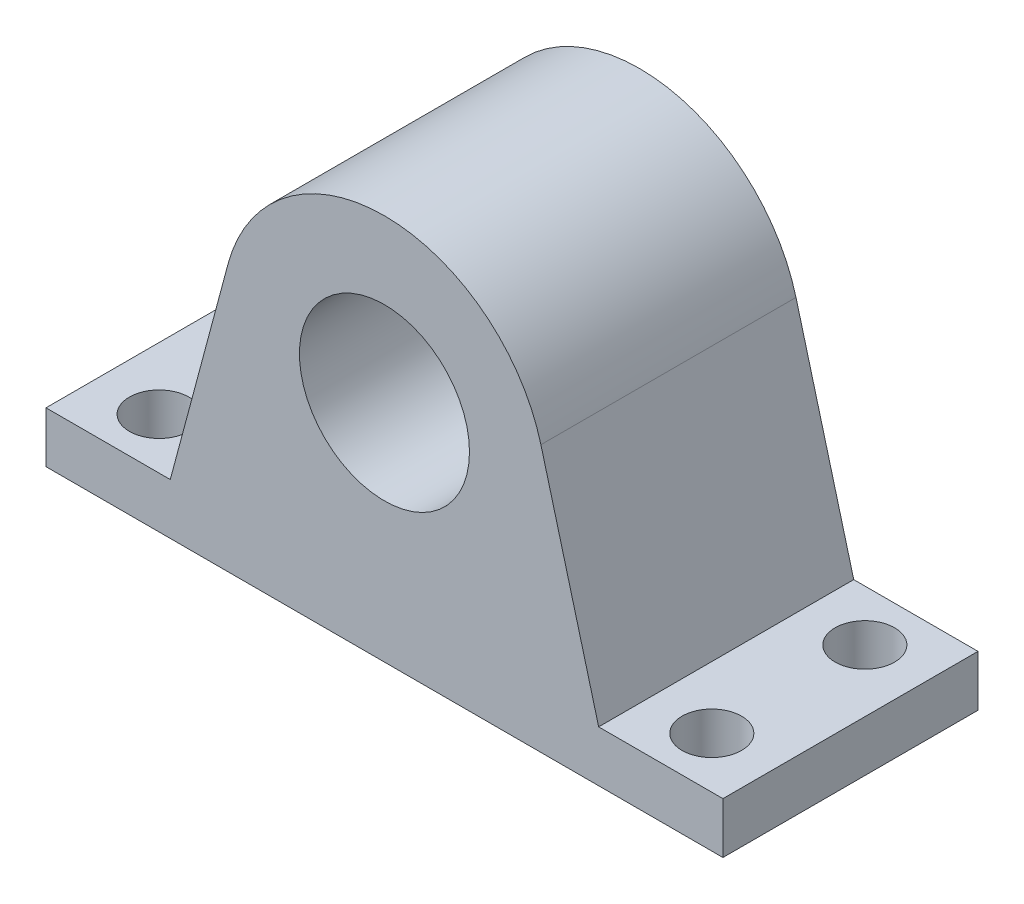
ISO-10303-21;
HEADER;
FILE_DESCRIPTION(('STEP AP214'),'2;1');
FILE_NAME('part.step','',(''),(''),'','','');
FILE_SCHEMA(('AUTOMOTIVE_DESIGN { 1 0 10303 214 1 1 1 1 }'));
ENDSEC;
DATA;
#1=APPLICATION_CONTEXT('core data for automotive mechanical design processes');
#2=APPLICATION_PROTOCOL_DEFINITION('international standard','automotive_design',2000,#1);
#3=PRODUCT_CONTEXT('',#1,'mechanical');
#4=PRODUCT('Part','Part','',(#3));
#5=PRODUCT_RELATED_PRODUCT_CATEGORY('part','',(#4));
#6=PRODUCT_DEFINITION_FORMATION('','',#4);
#7=PRODUCT_DEFINITION_CONTEXT('part definition',#1,'design');
#8=PRODUCT_DEFINITION('design','',#6,#7);
#9=PRODUCT_DEFINITION_SHAPE('','',#8);
#10=(LENGTH_UNIT() NAMED_UNIT(*) SI_UNIT(.MILLI.,.METRE.));
#11=(NAMED_UNIT(*) PLANE_ANGLE_UNIT() SI_UNIT($,.RADIAN.));
#12=(NAMED_UNIT(*) SI_UNIT($,.STERADIAN.) SOLID_ANGLE_UNIT());
#13=UNCERTAINTY_MEASURE_WITH_UNIT(LENGTH_MEASURE(1.E-05),#10,'distance_accuracy_value','');
#14=(GEOMETRIC_REPRESENTATION_CONTEXT(3) GLOBAL_UNCERTAINTY_ASSIGNED_CONTEXT((#13)) GLOBAL_UNIT_ASSIGNED_CONTEXT((#10,
#11,#12)) REPRESENTATION_CONTEXT('',''));
#15=CARTESIAN_POINT('',(0.,0.,0.));
#16=DIRECTION('',(0.,0.,1.));
#17=DIRECTION('',(1.,0.,0.));
#18=AXIS2_PLACEMENT_3D('',#15,#16,#17);
#19=CARTESIAN_POINT('',(18.4008869908067,31.3465028092031,30.));
#20=DIRECTION('',(0.965925826289067,0.258819045102525,0.));
#21=DIRECTION('',(-0.258819045102525,0.965925826289067,0.));
#22=AXIS2_PLACEMENT_3D('',#19,#20,#21);
#23=PLANE('',#22);
#24=DIRECTION('',(0.258819045102525,-0.965925826289067,0.));
#25=VECTOR('',#24,1.);
#26=CARTESIAN_POINT('',(18.4008869908067,31.3465028092031,0.));
#27=LINE('',#26,#25);
#28=CARTESIAN_POINT('',(18.4008869908067,31.3465028092031,0.));
#29=VERTEX_POINT('',#28);
#30=CARTESIAN_POINT('',(25.192461949486,6.,0.));
#31=VERTEX_POINT('',#30);
#32=EDGE_CURVE('E141',#29,#31,#27,.T.);
#33=ORIENTED_EDGE('',*,*,#32,.F.);
#34=DIRECTION('',(0.,0.,-1.));
#35=VECTOR('',#34,1.);
#36=CARTESIAN_POINT('',(18.4008869908067,31.3465028092031,30.));
#37=LINE('',#36,#35);
#38=CARTESIAN_POINT('',(18.4008869908067,31.3465028092031,30.));
#39=VERTEX_POINT('',#38);
#40=EDGE_CURVE('E11',#39,#29,#37,.T.);
#41=ORIENTED_EDGE('',*,*,#40,.F.);
#42=DIRECTION('',(0.258819045102525,-0.965925826289067,0.));
#43=VECTOR('',#42,1.);
#44=CARTESIAN_POINT('',(18.4008869908067,31.3465028092031,30.));
#45=LINE('',#44,#43);
#46=CARTESIAN_POINT('',(25.192461949486,6.,30.));
#47=VERTEX_POINT('',#46);
#48=EDGE_CURVE('E161',#39,#47,#45,.T.);
#49=ORIENTED_EDGE('',*,*,#48,.T.);
#50=DIRECTION('',(0.,0.,-1.));
#51=VECTOR('',#50,1.);
#52=CARTESIAN_POINT('',(25.192461949486,6.,30.));
#53=LINE('',#52,#51);
#54=EDGE_CURVE('E100',#47,#31,#53,.T.);
#55=ORIENTED_EDGE('',*,*,#54,.T.);
#56=EDGE_LOOP('',(#33,#41,#49,#55));
#57=FACE_BOUND('',#56,.T.);
#58=ADVANCED_FACE('F44',(#57),#23,.T.);
#59=CARTESIAN_POINT('',(0.,26.416,30.));
#60=DIRECTION('',(0.,0.,-1.));
#61=DIRECTION('',(-1.,0.,0.));
#62=AXIS2_PLACEMENT_3D('',#59,#60,#61);
#63=CYLINDRICAL_SURFACE('',#62,19.05);
#64=CARTESIAN_POINT('',(0.,26.416,0.));
#65=DIRECTION('',(0.,0.,1.));
#66=DIRECTION('',(1.,0.,0.));
#67=AXIS2_PLACEMENT_3D('',#64,#65,#66);
#68=CIRCLE('',#67,19.05);
#69=CARTESIAN_POINT('',(-18.4008869908067,31.3465028092031,0.));
#70=VERTEX_POINT('',#69);
#71=EDGE_CURVE('E160',#29,#70,#68,.T.);
#72=ORIENTED_EDGE('',*,*,#71,.T.);
#73=DIRECTION('',(0.,0.,-1.));
#74=VECTOR('',#73,1.);
#75=CARTESIAN_POINT('',(-18.4008869908067,31.3465028092031,30.));
#76=LINE('',#75,#74);
#77=CARTESIAN_POINT('',(-18.4008869908067,31.3465028092031,30.));
#78=VERTEX_POINT('',#77);
#79=EDGE_CURVE('E53',#78,#70,#76,.T.);
#80=ORIENTED_EDGE('',*,*,#79,.F.);
#81=CARTESIAN_POINT('',(0.,26.416,30.));
#82=DIRECTION('',(0.,0.,1.));
#83=DIRECTION('',(1.,0.,0.));
#84=AXIS2_PLACEMENT_3D('',#81,#82,#83);
#85=CIRCLE('',#84,19.05);
#86=EDGE_CURVE('E136',#39,#78,#85,.T.);
#87=ORIENTED_EDGE('',*,*,#86,.F.);
#88=ORIENTED_EDGE('',*,*,#40,.T.);
#89=EDGE_LOOP('',(#72,#80,#87,#88));
#90=FACE_BOUND('',#89,.T.);
#91=ADVANCED_FACE('F208',(#90),#63,.T.);
#92=CARTESIAN_POINT('',(-25.192461949486,6.,30.));
#93=DIRECTION('',(-0.965925826289067,0.258819045102524,0.));
#94=DIRECTION('',(-0.258819045102524,-0.965925826289067,0.));
#95=AXIS2_PLACEMENT_3D('',#92,#93,#94);
#96=PLANE('',#95);
#97=DIRECTION('',(0.258819045102524,0.965925826289067,0.));
#98=VECTOR('',#97,1.);
#99=CARTESIAN_POINT('',(-25.192461949486,6.,0.));
#100=LINE('',#99,#98);
#101=CARTESIAN_POINT('',(-25.192461949486,6.,0.));
#102=VERTEX_POINT('',#101);
#103=EDGE_CURVE('E120',#102,#70,#100,.T.);
#104=ORIENTED_EDGE('',*,*,#103,.F.);
#105=DIRECTION('',(0.,0.,-1.));
#106=VECTOR('',#105,1.);
#107=CARTESIAN_POINT('',(-25.192461949486,6.,30.));
#108=LINE('',#107,#106);
#109=CARTESIAN_POINT('',(-25.192461949486,6.,30.));
#110=VERTEX_POINT('',#109);
#111=EDGE_CURVE('E114',#110,#102,#108,.T.);
#112=ORIENTED_EDGE('',*,*,#111,.F.);
#113=DIRECTION('',(0.258819045102524,0.965925826289067,0.));
#114=VECTOR('',#113,1.);
#115=CARTESIAN_POINT('',(-25.192461949486,6.,30.));
#116=LINE('',#115,#114);
#117=EDGE_CURVE('E118',#110,#78,#116,.T.);
#118=ORIENTED_EDGE('',*,*,#117,.T.);
#119=ORIENTED_EDGE('',*,*,#79,.T.);
#120=EDGE_LOOP('',(#104,#112,#118,#119));
#121=FACE_BOUND('',#120,.T.);
#122=ADVANCED_FACE('F116',(#121),#96,.T.);
#123=CARTESIAN_POINT('',(-25.192461949486,6.,30.));
#124=DIRECTION('',(0.,-1.,0.));
#125=DIRECTION('',(1.,0.,0.));
#126=AXIS2_PLACEMENT_3D('',#123,#124,#125);
#127=PLANE('',#126);
#128=CARTESIAN_POINT('',(-32.5,6.,6.));
#129=DIRECTION('',(0.,1.,0.));
#130=DIRECTION('',(0.,0.,1.));
#131=AXIS2_PLACEMENT_3D('',#128,#129,#130);
#132=CIRCLE('',#131,3.49999999999999);
#133=CARTESIAN_POINT('',(-32.5,6.,9.49999999999999));
#134=VERTEX_POINT('',#133);
#135=EDGE_CURVE('E246',#134,#134,#132,.T.);
#136=ORIENTED_EDGE('',*,*,#135,.F.);
#137=EDGE_LOOP('',(#136));
#138=FACE_BOUND('',#137,.T.);
#139=CARTESIAN_POINT('',(-32.5,6.,24.));
#140=DIRECTION('',(0.,1.,0.));
#141=DIRECTION('',(0.,0.,1.));
#142=AXIS2_PLACEMENT_3D('',#139,#140,#141);
#143=CIRCLE('',#142,3.49999999999999);
#144=CARTESIAN_POINT('',(-32.5,6.,27.5));
#145=VERTEX_POINT('',#144);
#146=EDGE_CURVE('E182',#145,#145,#143,.T.);
#147=ORIENTED_EDGE('',*,*,#146,.F.);
#148=EDGE_LOOP('',(#147));
#149=FACE_BOUND('',#148,.T.);
#150=DIRECTION('',(-1.,0.,0.));
#151=VECTOR('',#150,1.);
#152=CARTESIAN_POINT('',(-25.192461949486,6.,0.));
#153=LINE('',#152,#151);
#154=CARTESIAN_POINT('',(-39.807538050514,5.99999999999999,0.));
#155=VERTEX_POINT('',#154);
#156=EDGE_CURVE('E157',#102,#155,#153,.T.);
#157=ORIENTED_EDGE('',*,*,#156,.T.);
#158=DIRECTION('',(0.,0.,-1.));
#159=VECTOR('',#158,1.);
#160=CARTESIAN_POINT('',(-39.807538050514,5.99999999999999,30.));
#161=LINE('',#160,#159);
#162=CARTESIAN_POINT('',(-39.807538050514,5.99999999999999,30.));
#163=VERTEX_POINT('',#162);
#164=EDGE_CURVE('E123',#163,#155,#161,.T.);
#165=ORIENTED_EDGE('',*,*,#164,.F.);
#166=DIRECTION('',(-1.,0.,0.));
#167=VECTOR('',#166,1.);
#168=CARTESIAN_POINT('',(-25.192461949486,6.,30.));
#169=LINE('',#168,#167);
#170=EDGE_CURVE('E126',#110,#163,#169,.T.);
#171=ORIENTED_EDGE('',*,*,#170,.F.);
#172=ORIENTED_EDGE('',*,*,#111,.T.);
#173=EDGE_LOOP('',(#157,#165,#171,#172));
#174=FACE_BOUND('',#173,.T.);
#175=ADVANCED_FACE('F127',(#138,#149,#174),#127,.F.);
#176=CARTESIAN_POINT('',(-39.807538050514,5.99999999999999,30.));
#177=DIRECTION('',(1.,0.,0.));
#178=DIRECTION('',(0.,0.,-1.));
#179=AXIS2_PLACEMENT_3D('',#176,#177,#178);
#180=PLANE('',#179);
#181=DIRECTION('',(0.,-1.,0.));
#182=VECTOR('',#181,1.);
#183=CARTESIAN_POINT('',(-39.807538050514,5.99999999999999,0.));
#184=LINE('',#183,#182);
#185=CARTESIAN_POINT('',(-39.807538050514,0.,0.));
#186=VERTEX_POINT('',#185);
#187=EDGE_CURVE('E154',#155,#186,#184,.T.);
#188=ORIENTED_EDGE('',*,*,#187,.T.);
#189=DIRECTION('',(0.,0.,-1.));
#190=VECTOR('',#189,1.);
#191=CARTESIAN_POINT('',(-39.807538050514,0.,30.));
#192=LINE('',#191,#190);
#193=CARTESIAN_POINT('',(-39.807538050514,0.,30.));
#194=VERTEX_POINT('',#193);
#195=EDGE_CURVE('E165',#194,#186,#192,.T.);
#196=ORIENTED_EDGE('',*,*,#195,.F.);
#197=DIRECTION('',(0.,-1.,0.));
#198=VECTOR('',#197,1.);
#199=CARTESIAN_POINT('',(-39.807538050514,5.99999999999999,30.));
#200=LINE('',#199,#198);
#201=EDGE_CURVE('E132',#163,#194,#200,.T.);
#202=ORIENTED_EDGE('',*,*,#201,.F.);
#203=ORIENTED_EDGE('',*,*,#164,.T.);
#204=EDGE_LOOP('',(#188,#196,#202,#203));
#205=FACE_BOUND('',#204,.T.);
#206=ADVANCED_FACE('F197',(#205),#180,.F.);
#207=CARTESIAN_POINT('',(0.,0.,30.));
#208=DIRECTION('',(0.,-1.,0.));
#209=DIRECTION('',(1.,0.,0.));
#210=AXIS2_PLACEMENT_3D('',#207,#208,#209);
#211=PLANE('',#210);
#212=CARTESIAN_POINT('',(32.5,0.,6.));
#213=DIRECTION('',(0.,-1.,0.));
#214=DIRECTION('',(1.,0.,0.));
#215=AXIS2_PLACEMENT_3D('',#212,#213,#214);
#216=CIRCLE('',#215,3.49999999999999);
#217=CARTESIAN_POINT('',(36.,0.,6.));
#218=VERTEX_POINT('',#217);
#219=EDGE_CURVE('E243',#218,#218,#216,.T.);
#220=ORIENTED_EDGE('',*,*,#219,.F.);
#221=EDGE_LOOP('',(#220));
#222=FACE_BOUND('',#221,.T.);
#223=CARTESIAN_POINT('',(32.5,0.,24.));
#224=DIRECTION('',(0.,-1.,0.));
#225=DIRECTION('',(1.,0.,0.));
#226=AXIS2_PLACEMENT_3D('',#223,#224,#225);
#227=CIRCLE('',#226,3.49999999999999);
#228=CARTESIAN_POINT('',(36.,0.,24.));
#229=VERTEX_POINT('',#228);
#230=EDGE_CURVE('E47',#229,#229,#227,.T.);
#231=ORIENTED_EDGE('',*,*,#230,.F.);
#232=EDGE_LOOP('',(#231));
#233=FACE_BOUND('',#232,.T.);
#234=CARTESIAN_POINT('',(-32.5,0.,6.));
#235=DIRECTION('',(0.,-1.,0.));
#236=DIRECTION('',(1.,0.,0.));
#237=AXIS2_PLACEMENT_3D('',#234,#235,#236);
#238=CIRCLE('',#237,3.49999999999999);
#239=CARTESIAN_POINT('',(-29.,0.,6.));
#240=VERTEX_POINT('',#239);
#241=EDGE_CURVE('E253',#240,#240,#238,.T.);
#242=ORIENTED_EDGE('',*,*,#241,.F.);
#243=EDGE_LOOP('',(#242));
#244=FACE_BOUND('',#243,.T.);
#245=CARTESIAN_POINT('',(-32.5,0.,24.));
#246=DIRECTION('',(0.,-1.,0.));
#247=DIRECTION('',(1.,0.,0.));
#248=AXIS2_PLACEMENT_3D('',#245,#246,#247);
#249=CIRCLE('',#248,3.49999999999999);
#250=CARTESIAN_POINT('',(-29.,0.,24.));
#251=VERTEX_POINT('',#250);
#252=EDGE_CURVE('E177',#251,#251,#249,.T.);
#253=ORIENTED_EDGE('',*,*,#252,.F.);
#254=EDGE_LOOP('',(#253));
#255=FACE_BOUND('',#254,.T.);
#256=DIRECTION('',(-1.,0.,0.));
#257=VECTOR('',#256,1.);
#258=CARTESIAN_POINT('',(0.,0.,0.));
#259=LINE('',#258,#257);
#260=CARTESIAN_POINT('',(39.807538050514,0.,0.));
#261=VERTEX_POINT('',#260);
#262=EDGE_CURVE('E151',#261,#186,#259,.T.);
#263=ORIENTED_EDGE('',*,*,#262,.F.);
#264=DIRECTION('',(0.,0.,-1.));
#265=VECTOR('',#264,1.);
#266=CARTESIAN_POINT('',(39.807538050514,0.,30.));
#267=LINE('',#266,#265);
#268=CARTESIAN_POINT('',(39.807538050514,0.,30.));
#269=VERTEX_POINT('',#268);
#270=EDGE_CURVE('E167',#269,#261,#267,.T.);
#271=ORIENTED_EDGE('',*,*,#270,.F.);
#272=DIRECTION('',(1.,0.,0.));
#273=VECTOR('',#272,1.);
#274=CARTESIAN_POINT('',(0.,0.,30.));
#275=LINE('',#274,#273);
#276=EDGE_CURVE('E192',#194,#269,#275,.T.);
#277=ORIENTED_EDGE('',*,*,#276,.F.);
#278=ORIENTED_EDGE('',*,*,#195,.T.);
#279=EDGE_LOOP('',(#263,#271,#277,#278));
#280=FACE_BOUND('',#279,.T.);
#281=ADVANCED_FACE('F200',(#222,#233,#244,#255,#280),#211,.T.);
#282=CARTESIAN_POINT('',(39.807538050514,5.99999999999999,30.));
#283=DIRECTION('',(1.,0.,0.));
#284=DIRECTION('',(0.,0.,-1.));
#285=AXIS2_PLACEMENT_3D('',#282,#283,#284);
#286=PLANE('',#285);
#287=DIRECTION('',(0.,-1.,0.));
#288=VECTOR('',#287,1.);
#289=CARTESIAN_POINT('',(39.807538050514,5.99999999999999,0.));
#290=LINE('',#289,#288);
#291=CARTESIAN_POINT('',(39.807538050514,5.99999999999999,0.));
#292=VERTEX_POINT('',#291);
#293=EDGE_CURVE('E148',#292,#261,#290,.T.);
#294=ORIENTED_EDGE('',*,*,#293,.F.);
#295=DIRECTION('',(0.,0.,-1.));
#296=VECTOR('',#295,1.);
#297=CARTESIAN_POINT('',(39.807538050514,5.99999999999999,30.));
#298=LINE('',#297,#296);
#299=CARTESIAN_POINT('',(39.807538050514,5.99999999999999,30.));
#300=VERTEX_POINT('',#299);
#301=EDGE_CURVE('E170',#300,#292,#298,.T.);
#302=ORIENTED_EDGE('',*,*,#301,.F.);
#303=DIRECTION('',(0.,-1.,0.));
#304=VECTOR('',#303,1.);
#305=CARTESIAN_POINT('',(39.807538050514,5.99999999999999,30.));
#306=LINE('',#305,#304);
#307=EDGE_CURVE('E189',#300,#269,#306,.T.);
#308=ORIENTED_EDGE('',*,*,#307,.T.);
#309=ORIENTED_EDGE('',*,*,#270,.T.);
#310=EDGE_LOOP('',(#294,#302,#308,#309));
#311=FACE_BOUND('',#310,.T.);
#312=ADVANCED_FACE('F203',(#311),#286,.T.);
#313=CARTESIAN_POINT('',(25.192461949486,6.,30.));
#314=DIRECTION('',(0.,1.,0.));
#315=DIRECTION('',(-1.,0.,0.));
#316=AXIS2_PLACEMENT_3D('',#313,#314,#315);
#317=PLANE('',#316);
#318=CARTESIAN_POINT('',(32.5,6.,6.));
#319=DIRECTION('',(0.,1.,0.));
#320=DIRECTION('',(0.,0.,1.));
#321=AXIS2_PLACEMENT_3D('',#318,#319,#320);
#322=CIRCLE('',#321,3.49999999999999);
#323=CARTESIAN_POINT('',(32.5,6.,9.49999999999999));
#324=VERTEX_POINT('',#323);
#325=EDGE_CURVE('E238',#324,#324,#322,.T.);
#326=ORIENTED_EDGE('',*,*,#325,.F.);
#327=EDGE_LOOP('',(#326));
#328=FACE_BOUND('',#327,.T.);
#329=CARTESIAN_POINT('',(32.5,6.,24.));
#330=DIRECTION('',(0.,1.,0.));
#331=DIRECTION('',(0.,0.,1.));
#332=AXIS2_PLACEMENT_3D('',#329,#330,#331);
#333=CIRCLE('',#332,3.49999999999999);
#334=CARTESIAN_POINT('',(32.5,6.,27.5));
#335=VERTEX_POINT('',#334);
#336=EDGE_CURVE('E241',#335,#335,#333,.T.);
#337=ORIENTED_EDGE('',*,*,#336,.F.);
#338=EDGE_LOOP('',(#337));
#339=FACE_BOUND('',#338,.T.);
#340=DIRECTION('',(1.,0.,0.));
#341=VECTOR('',#340,1.);
#342=CARTESIAN_POINT('',(25.192461949486,6.,0.));
#343=LINE('',#342,#341);
#344=EDGE_CURVE('E144',#31,#292,#343,.T.);
#345=ORIENTED_EDGE('',*,*,#344,.F.);
#346=ORIENTED_EDGE('',*,*,#54,.F.);
#347=DIRECTION('',(1.,0.,0.));
#348=VECTOR('',#347,1.);
#349=CARTESIAN_POINT('',(25.192461949486,6.,30.));
#350=LINE('',#349,#348);
#351=EDGE_CURVE('E187',#47,#300,#350,.T.);
#352=ORIENTED_EDGE('',*,*,#351,.T.);
#353=ORIENTED_EDGE('',*,*,#301,.T.);
#354=EDGE_LOOP('',(#345,#346,#352,#353));
#355=FACE_BOUND('',#354,.T.);
#356=ADVANCED_FACE('F204',(#328,#339,#355),#317,.T.);
#357=CARTESIAN_POINT('',(0.,26.416,30.));
#358=DIRECTION('',(0.,0.,1.));
#359=DIRECTION('',(1.,0.,0.));
#360=AXIS2_PLACEMENT_3D('',#357,#358,#359);
#361=PLANE('',#360);
#362=CARTESIAN_POINT('',(0.,26.416,30.));
#363=DIRECTION('',(0.,0.,1.));
#364=DIRECTION('',(1.,0.,0.));
#365=AXIS2_PLACEMENT_3D('',#362,#363,#364);
#366=CIRCLE('',#365,9.99999999999999);
#367=CARTESIAN_POINT('',(9.99999999999999,26.416,30.));
#368=VERTEX_POINT('',#367);
#369=EDGE_CURVE('E173',#368,#368,#366,.T.);
#370=ORIENTED_EDGE('',*,*,#369,.F.);
#371=EDGE_LOOP('',(#370));
#372=FACE_BOUND('',#371,.T.);
#373=ORIENTED_EDGE('',*,*,#48,.F.);
#374=ORIENTED_EDGE('',*,*,#86,.T.);
#375=ORIENTED_EDGE('',*,*,#117,.F.);
#376=ORIENTED_EDGE('',*,*,#170,.T.);
#377=ORIENTED_EDGE('',*,*,#201,.T.);
#378=ORIENTED_EDGE('',*,*,#276,.T.);
#379=ORIENTED_EDGE('',*,*,#307,.F.);
#380=ORIENTED_EDGE('',*,*,#351,.F.);
#381=EDGE_LOOP('',(#373,#374,#375,#376,#377,#378,#379,#380));
#382=FACE_BOUND('',#381,.T.);
#383=ADVANCED_FACE('F135',(#372,#382),#361,.T.);
#384=CARTESIAN_POINT('',(0.,26.416,0.));
#385=DIRECTION('',(0.,0.,1.));
#386=DIRECTION('',(1.,0.,0.));
#387=AXIS2_PLACEMENT_3D('',#384,#385,#386);
#388=PLANE('',#387);
#389=CARTESIAN_POINT('',(0.,26.416,0.));
#390=DIRECTION('',(0.,0.,1.));
#391=DIRECTION('',(1.,0.,0.));
#392=AXIS2_PLACEMENT_3D('',#389,#390,#391);
#393=CIRCLE('',#392,9.99999999999999);
#394=CARTESIAN_POINT('',(9.99999999999998,26.416,0.));
#395=VERTEX_POINT('',#394);
#396=EDGE_CURVE('E145',#395,#395,#393,.T.);
#397=ORIENTED_EDGE('',*,*,#396,.T.);
#398=EDGE_LOOP('',(#397));
#399=FACE_BOUND('',#398,.T.);
#400=ORIENTED_EDGE('',*,*,#32,.T.);
#401=ORIENTED_EDGE('',*,*,#344,.T.);
#402=ORIENTED_EDGE('',*,*,#293,.T.);
#403=ORIENTED_EDGE('',*,*,#262,.T.);
#404=ORIENTED_EDGE('',*,*,#187,.F.);
#405=ORIENTED_EDGE('',*,*,#156,.F.);
#406=ORIENTED_EDGE('',*,*,#103,.T.);
#407=ORIENTED_EDGE('',*,*,#71,.F.);
#408=EDGE_LOOP('',(#400,#401,#402,#403,#404,#405,#406,#407));
#409=FACE_BOUND('',#408,.T.);
#410=ADVANCED_FACE('F206',(#399,#409),#388,.F.);
#411=CARTESIAN_POINT('',(0.,26.416,30.));
#412=DIRECTION('',(0.,0.,1.));
#413=DIRECTION('',(1.,0.,0.));
#414=AXIS2_PLACEMENT_3D('',#411,#412,#413);
#415=CYLINDRICAL_SURFACE('',#414,9.99999999999999);
#416=ORIENTED_EDGE('',*,*,#369,.T.);
#417=EDGE_LOOP('',(#416));
#418=FACE_BOUND('',#417,.T.);
#419=ORIENTED_EDGE('',*,*,#396,.F.);
#420=EDGE_LOOP('',(#419));
#421=FACE_BOUND('',#420,.T.);
#422=ADVANCED_FACE('F262',(#418,#421),#415,.F.);
#423=CARTESIAN_POINT('',(-32.5,6.,24.));
#424=DIRECTION('',(0.,1.,0.));
#425=DIRECTION('',(0.,0.,1.));
#426=AXIS2_PLACEMENT_3D('',#423,#424,#425);
#427=CYLINDRICAL_SURFACE('',#426,3.49999999999999);
#428=ORIENTED_EDGE('',*,*,#252,.T.);
#429=EDGE_LOOP('',(#428));
#430=FACE_BOUND('',#429,.T.);
#431=ORIENTED_EDGE('',*,*,#146,.T.);
#432=EDGE_LOOP('',(#431));
#433=FACE_BOUND('',#432,.T.);
#434=ADVANCED_FACE('F258',(#430,#433),#427,.F.);
#435=CARTESIAN_POINT('',(-32.5,6.,6.));
#436=DIRECTION('',(0.,1.,0.));
#437=DIRECTION('',(0.,0.,1.));
#438=AXIS2_PLACEMENT_3D('',#435,#436,#437);
#439=CYLINDRICAL_SURFACE('',#438,3.49999999999999);
#440=ORIENTED_EDGE('',*,*,#241,.T.);
#441=EDGE_LOOP('',(#440));
#442=FACE_BOUND('',#441,.T.);
#443=ORIENTED_EDGE('',*,*,#135,.T.);
#444=EDGE_LOOP('',(#443));
#445=FACE_BOUND('',#444,.T.);
#446=ADVANCED_FACE('F261',(#442,#445),#439,.F.);
#447=CARTESIAN_POINT('',(32.5,6.,24.));
#448=DIRECTION('',(0.,1.,0.));
#449=DIRECTION('',(0.,0.,1.));
#450=AXIS2_PLACEMENT_3D('',#447,#448,#449);
#451=CYLINDRICAL_SURFACE('',#450,3.49999999999999);
#452=ORIENTED_EDGE('',*,*,#230,.T.);
#453=EDGE_LOOP('',(#452));
#454=FACE_BOUND('',#453,.T.);
#455=ORIENTED_EDGE('',*,*,#336,.T.);
#456=EDGE_LOOP('',(#455));
#457=FACE_BOUND('',#456,.T.);
#458=ADVANCED_FACE('F269',(#454,#457),#451,.F.);
#459=CARTESIAN_POINT('',(32.5,6.,6.));
#460=DIRECTION('',(0.,1.,0.));
#461=DIRECTION('',(0.,0.,1.));
#462=AXIS2_PLACEMENT_3D('',#459,#460,#461);
#463=CYLINDRICAL_SURFACE('',#462,3.49999999999999);
#464=ORIENTED_EDGE('',*,*,#219,.T.);
#465=EDGE_LOOP('',(#464));
#466=FACE_BOUND('',#465,.T.);
#467=ORIENTED_EDGE('',*,*,#325,.T.);
#468=EDGE_LOOP('',(#467));
#469=FACE_BOUND('',#468,.T.);
#470=ADVANCED_FACE('F276',(#466,#469),#463,.F.);
#471=CLOSED_SHELL('',(#58,#91,#122,#175,#206,#281,#312,#356,#383,#410,#422,#434,#446,#458,#470));
#472=MANIFOLD_SOLID_BREP('B2',#471);
#473=ADVANCED_BREP_SHAPE_REPRESENTATION('',(#18,#472),#14);
#474=SHAPE_DEFINITION_REPRESENTATION(#9,#473);
ENDSEC;
END-ISO-10303-21;
